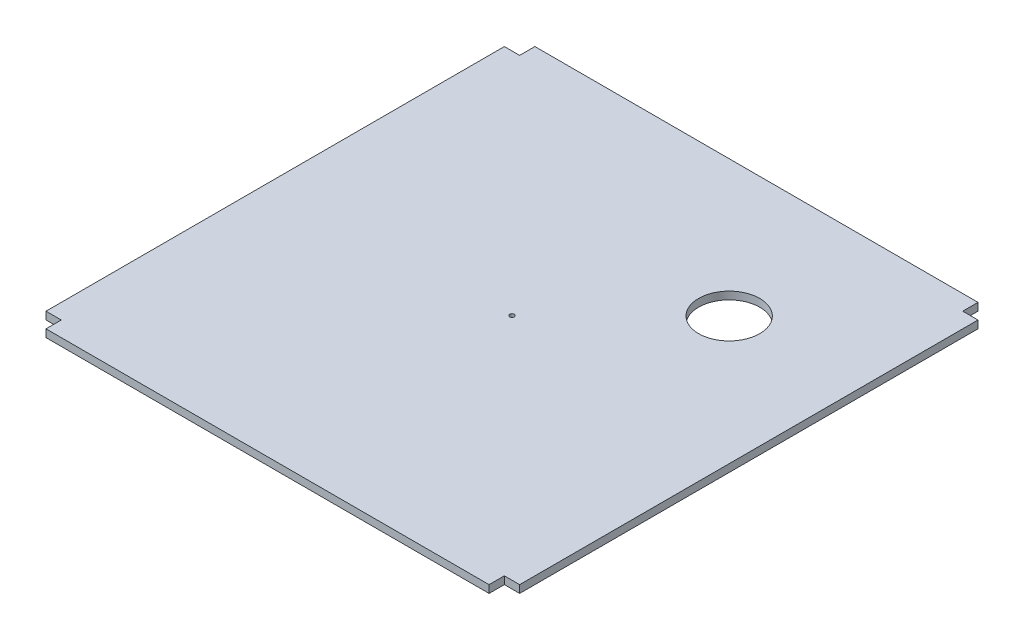
ISO-10303-21;
HEADER;
FILE_DESCRIPTION(('STEP AP214'),'2;1');
FILE_NAME('part.step','',(''),(''),'','','');
FILE_SCHEMA(('AUTOMOTIVE_DESIGN { 1 0 10303 214 1 1 1 1 }'));
ENDSEC;
DATA;
#1=APPLICATION_CONTEXT('core data for automotive mechanical design processes');
#2=APPLICATION_PROTOCOL_DEFINITION('international standard','automotive_design',2000,#1);
#3=PRODUCT_CONTEXT('',#1,'mechanical');
#4=PRODUCT('Part','Part','',(#3));
#5=PRODUCT_RELATED_PRODUCT_CATEGORY('part','',(#4));
#6=PRODUCT_DEFINITION_FORMATION('','',#4);
#7=PRODUCT_DEFINITION_CONTEXT('part definition',#1,'design');
#8=PRODUCT_DEFINITION('design','',#6,#7);
#9=PRODUCT_DEFINITION_SHAPE('','',#8);
#10=(LENGTH_UNIT() NAMED_UNIT(*) SI_UNIT(.MILLI.,.METRE.));
#11=(NAMED_UNIT(*) PLANE_ANGLE_UNIT() SI_UNIT($,.RADIAN.));
#12=(NAMED_UNIT(*) SI_UNIT($,.STERADIAN.) SOLID_ANGLE_UNIT());
#13=UNCERTAINTY_MEASURE_WITH_UNIT(LENGTH_MEASURE(1.E-05),#10,'distance_accuracy_value','');
#14=(GEOMETRIC_REPRESENTATION_CONTEXT(3) GLOBAL_UNCERTAINTY_ASSIGNED_CONTEXT((#13)) GLOBAL_UNIT_ASSIGNED_CONTEXT((#10,
#11,#12)) REPRESENTATION_CONTEXT('',''));
#15=CARTESIAN_POINT('',(0.,0.,0.));
#16=DIRECTION('',(0.,0.,1.));
#17=DIRECTION('',(1.,0.,0.));
#18=AXIS2_PLACEMENT_3D('',#15,#16,#17);
#19=CARTESIAN_POINT('',(155.,5.,160.));
#20=DIRECTION('',(-1.,0.,0.));
#21=DIRECTION('',(0.,0.,1.));
#22=AXIS2_PLACEMENT_3D('',#19,#20,#21);
#23=PLANE('',#22);
#24=DIRECTION('',(0.,1.,0.));
#25=VECTOR('',#24,1.);
#26=CARTESIAN_POINT('',(155.,0.,150.));
#27=LINE('',#26,#25);
#28=CARTESIAN_POINT('',(155.,0.,150.));
#29=VERTEX_POINT('',#28);
#30=CARTESIAN_POINT('',(155.,5.,150.));
#31=VERTEX_POINT('',#30);
#32=EDGE_CURVE('E228',#29,#31,#27,.T.);
#33=ORIENTED_EDGE('',*,*,#32,.F.);
#34=DIRECTION('',(0.,0.,-1.));
#35=VECTOR('',#34,1.);
#36=CARTESIAN_POINT('',(155.,0.,160.));
#37=LINE('',#36,#35);
#38=CARTESIAN_POINT('',(155.,0.,-150.));
#39=VERTEX_POINT('',#38);
#40=EDGE_CURVE('E167',#29,#39,#37,.T.);
#41=ORIENTED_EDGE('',*,*,#40,.T.);
#42=DIRECTION('',(0.,1.,0.));
#43=VECTOR('',#42,1.);
#44=CARTESIAN_POINT('',(155.,0.,-150.));
#45=LINE('',#44,#43);
#46=CARTESIAN_POINT('',(155.,5.,-150.));
#47=VERTEX_POINT('',#46);
#48=EDGE_CURVE('E204',#39,#47,#45,.T.);
#49=ORIENTED_EDGE('',*,*,#48,.T.);
#50=DIRECTION('',(0.,0.,-1.));
#51=VECTOR('',#50,1.);
#52=CARTESIAN_POINT('',(155.,5.,160.));
#53=LINE('',#52,#51);
#54=EDGE_CURVE('E165',#31,#47,#53,.T.);
#55=ORIENTED_EDGE('',*,*,#54,.F.);
#56=EDGE_LOOP('',(#33,#41,#49,#55));
#57=FACE_BOUND('',#56,.T.);
#58=ADVANCED_FACE('F44',(#57),#23,.F.);
#59=CARTESIAN_POINT('',(-155.,5.,-160.));
#60=DIRECTION('',(0.,0.,1.));
#61=DIRECTION('',(1.,0.,0.));
#62=AXIS2_PLACEMENT_3D('',#59,#60,#61);
#63=PLANE('',#62);
#64=DIRECTION('',(0.,1.,0.));
#65=VECTOR('',#64,1.);
#66=CARTESIAN_POINT('',(145.,0.,-160.));
#67=LINE('',#66,#65);
#68=CARTESIAN_POINT('',(145.,0.,-160.));
#69=VERTEX_POINT('',#68);
#70=CARTESIAN_POINT('',(145.,5.,-160.));
#71=VERTEX_POINT('',#70);
#72=EDGE_CURVE('E215',#69,#71,#67,.T.);
#73=ORIENTED_EDGE('',*,*,#72,.F.);
#74=DIRECTION('',(-1.,0.,0.));
#75=VECTOR('',#74,1.);
#76=CARTESIAN_POINT('',(-155.,0.,-160.));
#77=LINE('',#76,#75);
#78=CARTESIAN_POINT('',(-145.,0.,-160.));
#79=VERTEX_POINT('',#78);
#80=EDGE_CURVE('E166',#69,#79,#77,.T.);
#81=ORIENTED_EDGE('',*,*,#80,.T.);
#82=DIRECTION('',(0.,1.,0.));
#83=VECTOR('',#82,1.);
#84=CARTESIAN_POINT('',(-145.,0.,-160.));
#85=LINE('',#84,#83);
#86=CARTESIAN_POINT('',(-145.,5.,-160.));
#87=VERTEX_POINT('',#86);
#88=EDGE_CURVE('E168',#79,#87,#85,.T.);
#89=ORIENTED_EDGE('',*,*,#88,.T.);
#90=DIRECTION('',(-1.,0.,0.));
#91=VECTOR('',#90,1.);
#92=CARTESIAN_POINT('',(-155.,5.,-160.));
#93=LINE('',#92,#91);
#94=EDGE_CURVE('E157',#71,#87,#93,.T.);
#95=ORIENTED_EDGE('',*,*,#94,.F.);
#96=EDGE_LOOP('',(#73,#81,#89,#95));
#97=FACE_BOUND('',#96,.T.);
#98=ADVANCED_FACE('F266',(#97),#63,.F.);
#99=CARTESIAN_POINT('',(-155.,5.,-160.));
#100=DIRECTION('',(1.,0.,0.));
#101=DIRECTION('',(0.,0.,-1.));
#102=AXIS2_PLACEMENT_3D('',#99,#100,#101);
#103=PLANE('',#102);
#104=DIRECTION('',(0.,0.,1.));
#105=VECTOR('',#104,1.);
#106=CARTESIAN_POINT('',(-155.,0.,-160.));
#107=LINE('',#106,#105);
#108=CARTESIAN_POINT('',(-155.,0.,-150.));
#109=VERTEX_POINT('',#108);
#110=CARTESIAN_POINT('',(-155.,0.,150.));
#111=VERTEX_POINT('',#110);
#112=EDGE_CURVE('E151',#109,#111,#107,.T.);
#113=ORIENTED_EDGE('',*,*,#112,.T.);
#114=DIRECTION('',(0.,1.,0.));
#115=VECTOR('',#114,1.);
#116=CARTESIAN_POINT('',(-155.,0.,150.));
#117=LINE('',#116,#115);
#118=CARTESIAN_POINT('',(-155.,5.,150.));
#119=VERTEX_POINT('',#118);
#120=EDGE_CURVE('E138',#111,#119,#117,.T.);
#121=ORIENTED_EDGE('',*,*,#120,.T.);
#122=DIRECTION('',(0.,0.,1.));
#123=VECTOR('',#122,1.);
#124=CARTESIAN_POINT('',(-155.,5.,-160.));
#125=LINE('',#124,#123);
#126=CARTESIAN_POINT('',(-155.,5.,-150.));
#127=VERTEX_POINT('',#126);
#128=EDGE_CURVE('E52',#127,#119,#125,.T.);
#129=ORIENTED_EDGE('',*,*,#128,.F.);
#130=DIRECTION('',(0.,1.,0.));
#131=VECTOR('',#130,1.);
#132=CARTESIAN_POINT('',(-155.,0.,-150.));
#133=LINE('',#132,#131);
#134=EDGE_CURVE('E185',#109,#127,#133,.T.);
#135=ORIENTED_EDGE('',*,*,#134,.F.);
#136=EDGE_LOOP('',(#113,#121,#129,#135));
#137=FACE_BOUND('',#136,.T.);
#138=ADVANCED_FACE('F146',(#137),#103,.F.);
#139=CARTESIAN_POINT('',(-155.,5.,160.));
#140=DIRECTION('',(0.,0.,-1.));
#141=DIRECTION('',(-1.,0.,0.));
#142=AXIS2_PLACEMENT_3D('',#139,#140,#141);
#143=PLANE('',#142);
#144=DIRECTION('',(0.,1.,0.));
#145=VECTOR('',#144,1.);
#146=CARTESIAN_POINT('',(-145.,0.,160.));
#147=LINE('',#146,#145);
#148=CARTESIAN_POINT('',(-145.,0.,160.));
#149=VERTEX_POINT('',#148);
#150=CARTESIAN_POINT('',(-145.,5.,160.));
#151=VERTEX_POINT('',#150);
#152=EDGE_CURVE('E239',#149,#151,#147,.T.);
#153=ORIENTED_EDGE('',*,*,#152,.F.);
#154=DIRECTION('',(1.,0.,0.));
#155=VECTOR('',#154,1.);
#156=CARTESIAN_POINT('',(-155.,0.,160.));
#157=LINE('',#156,#155);
#158=CARTESIAN_POINT('',(145.,0.,160.));
#159=VERTEX_POINT('',#158);
#160=EDGE_CURVE('E48',#149,#159,#157,.T.);
#161=ORIENTED_EDGE('',*,*,#160,.T.);
#162=DIRECTION('',(0.,1.,0.));
#163=VECTOR('',#162,1.);
#164=CARTESIAN_POINT('',(145.,0.,160.));
#165=LINE('',#164,#163);
#166=CARTESIAN_POINT('',(145.,5.,160.));
#167=VERTEX_POINT('',#166);
#168=EDGE_CURVE('E216',#159,#167,#165,.T.);
#169=ORIENTED_EDGE('',*,*,#168,.T.);
#170=DIRECTION('',(1.,0.,0.));
#171=VECTOR('',#170,1.);
#172=CARTESIAN_POINT('',(-155.,5.,160.));
#173=LINE('',#172,#171);
#174=EDGE_CURVE('E11',#151,#167,#173,.T.);
#175=ORIENTED_EDGE('',*,*,#174,.F.);
#176=EDGE_LOOP('',(#153,#161,#169,#175));
#177=FACE_BOUND('',#176,.T.);
#178=ADVANCED_FACE('F251',(#177),#143,.F.);
#179=CARTESIAN_POINT('',(0.,5.,0.));
#180=DIRECTION('',(0.,-1.,0.));
#181=DIRECTION('',(0.,0.,-1.));
#182=AXIS2_PLACEMENT_3D('',#179,#180,#181);
#183=PLANE('',#182);
#184=CARTESIAN_POINT('',(0.,5.,0.));
#185=DIRECTION('',(0.,1.,0.));
#186=DIRECTION('',(0.,0.,1.));
#187=AXIS2_PLACEMENT_3D('',#184,#185,#186);
#188=CIRCLE('',#187,1.5);
#189=CARTESIAN_POINT('',(0.,5.,1.5));
#190=VERTEX_POINT('',#189);
#191=EDGE_CURVE('E199',#190,#190,#188,.T.);
#192=ORIENTED_EDGE('',*,*,#191,.F.);
#193=EDGE_LOOP('',(#192));
#194=FACE_BOUND('',#193,.T.);
#195=CARTESIAN_POINT('',(71.3155891649549,5.,-70.8266158009688));
#196=DIRECTION('',(0.,1.,0.));
#197=DIRECTION('',(0.,0.,1.));
#198=AXIS2_PLACEMENT_3D('',#195,#196,#197);
#199=CIRCLE('',#198,20.);
#200=CARTESIAN_POINT('',(71.3155891649549,5.,-50.8266158009688));
#201=VERTEX_POINT('',#200);
#202=EDGE_CURVE('E203',#201,#201,#199,.T.);
#203=ORIENTED_EDGE('',*,*,#202,.F.);
#204=EDGE_LOOP('',(#203));
#205=FACE_BOUND('',#204,.T.);
#206=DIRECTION('',(0.,0.,-1.));
#207=VECTOR('',#206,1.);
#208=CARTESIAN_POINT('',(-145.,5.,160.));
#209=LINE('',#208,#207);
#210=CARTESIAN_POINT('',(-145.,5.,150.));
#211=VERTEX_POINT('',#210);
#212=EDGE_CURVE('E142',#151,#211,#209,.T.);
#213=ORIENTED_EDGE('',*,*,#212,.F.);
#214=ORIENTED_EDGE('',*,*,#174,.T.);
#215=DIRECTION('',(0.,0.,1.));
#216=VECTOR('',#215,1.);
#217=CARTESIAN_POINT('',(145.,5.,160.));
#218=LINE('',#217,#216);
#219=CARTESIAN_POINT('',(145.,5.,150.));
#220=VERTEX_POINT('',#219);
#221=EDGE_CURVE('E227',#220,#167,#218,.T.);
#222=ORIENTED_EDGE('',*,*,#221,.F.);
#223=DIRECTION('',(-1.,0.,0.));
#224=VECTOR('',#223,1.);
#225=CARTESIAN_POINT('',(155.,5.,150.));
#226=LINE('',#225,#224);
#227=EDGE_CURVE('E155',#31,#220,#226,.T.);
#228=ORIENTED_EDGE('',*,*,#227,.F.);
#229=ORIENTED_EDGE('',*,*,#54,.T.);
#230=DIRECTION('',(1.,0.,0.));
#231=VECTOR('',#230,1.);
#232=CARTESIAN_POINT('',(155.,5.,-150.));
#233=LINE('',#232,#231);
#234=CARTESIAN_POINT('',(145.,5.,-150.));
#235=VERTEX_POINT('',#234);
#236=EDGE_CURVE('E208',#235,#47,#233,.T.);
#237=ORIENTED_EDGE('',*,*,#236,.F.);
#238=DIRECTION('',(0.,0.,1.));
#239=VECTOR('',#238,1.);
#240=CARTESIAN_POINT('',(145.,5.,-160.));
#241=LINE('',#240,#239);
#242=EDGE_CURVE('E213',#71,#235,#241,.T.);
#243=ORIENTED_EDGE('',*,*,#242,.F.);
#244=ORIENTED_EDGE('',*,*,#94,.T.);
#245=DIRECTION('',(0.,0.,-1.));
#246=VECTOR('',#245,1.);
#247=CARTESIAN_POINT('',(-145.,5.,-160.));
#248=LINE('',#247,#246);
#249=CARTESIAN_POINT('',(-145.,5.,-150.));
#250=VERTEX_POINT('',#249);
#251=EDGE_CURVE('E189',#250,#87,#248,.T.);
#252=ORIENTED_EDGE('',*,*,#251,.F.);
#253=DIRECTION('',(1.,0.,0.));
#254=VECTOR('',#253,1.);
#255=CARTESIAN_POINT('',(-155.,5.,-150.));
#256=LINE('',#255,#254);
#257=EDGE_CURVE('E158',#127,#250,#256,.T.);
#258=ORIENTED_EDGE('',*,*,#257,.F.);
#259=ORIENTED_EDGE('',*,*,#128,.T.);
#260=DIRECTION('',(-1.,0.,0.));
#261=VECTOR('',#260,1.);
#262=CARTESIAN_POINT('',(-155.,5.,150.));
#263=LINE('',#262,#261);
#264=EDGE_CURVE('E133',#211,#119,#263,.T.);
#265=ORIENTED_EDGE('',*,*,#264,.F.);
#266=EDGE_LOOP('',(#213,#214,#222,#228,#229,#237,#243,#244,#252,#258,#259,#265));
#267=FACE_BOUND('',#266,.T.);
#268=ADVANCED_FACE('F154',(#194,#205,#267),#183,.F.);
#269=CARTESIAN_POINT('',(0.,0.,0.));
#270=DIRECTION('',(0.,-1.,0.));
#271=DIRECTION('',(0.,0.,-1.));
#272=AXIS2_PLACEMENT_3D('',#269,#270,#271);
#273=PLANE('',#272);
#274=CARTESIAN_POINT('',(0.,0.,0.));
#275=DIRECTION('',(0.,1.,0.));
#276=DIRECTION('',(0.,0.,1.));
#277=AXIS2_PLACEMENT_3D('',#274,#275,#276);
#278=CIRCLE('',#277,1.5);
#279=CARTESIAN_POINT('',(0.,0.,1.5));
#280=VERTEX_POINT('',#279);
#281=EDGE_CURVE('E197',#280,#280,#278,.T.);
#282=ORIENTED_EDGE('',*,*,#281,.T.);
#283=EDGE_LOOP('',(#282));
#284=FACE_BOUND('',#283,.T.);
#285=CARTESIAN_POINT('',(71.3155891649549,0.,-70.8266158009688));
#286=DIRECTION('',(0.,1.,0.));
#287=DIRECTION('',(0.,0.,1.));
#288=AXIS2_PLACEMENT_3D('',#285,#286,#287);
#289=CIRCLE('',#288,20.);
#290=CARTESIAN_POINT('',(71.3155891649549,0.,-50.8266158009688));
#291=VERTEX_POINT('',#290);
#292=EDGE_CURVE('E243',#291,#291,#289,.T.);
#293=ORIENTED_EDGE('',*,*,#292,.T.);
#294=EDGE_LOOP('',(#293));
#295=FACE_BOUND('',#294,.T.);
#296=DIRECTION('',(0.,0.,-1.));
#297=VECTOR('',#296,1.);
#298=CARTESIAN_POINT('',(-145.,0.,160.));
#299=LINE('',#298,#297);
#300=CARTESIAN_POINT('',(-145.,0.,150.));
#301=VERTEX_POINT('',#300);
#302=EDGE_CURVE('E141',#149,#301,#299,.T.);
#303=ORIENTED_EDGE('',*,*,#302,.T.);
#304=DIRECTION('',(-1.,0.,0.));
#305=VECTOR('',#304,1.);
#306=CARTESIAN_POINT('',(-155.,0.,150.));
#307=LINE('',#306,#305);
#308=EDGE_CURVE('E62',#301,#111,#307,.T.);
#309=ORIENTED_EDGE('',*,*,#308,.T.);
#310=ORIENTED_EDGE('',*,*,#112,.F.);
#311=DIRECTION('',(1.,0.,0.));
#312=VECTOR('',#311,1.);
#313=CARTESIAN_POINT('',(-155.,0.,-150.));
#314=LINE('',#313,#312);
#315=CARTESIAN_POINT('',(-145.,0.,-150.));
#316=VERTEX_POINT('',#315);
#317=EDGE_CURVE('E193',#109,#316,#314,.T.);
#318=ORIENTED_EDGE('',*,*,#317,.T.);
#319=DIRECTION('',(0.,0.,-1.));
#320=VECTOR('',#319,1.);
#321=CARTESIAN_POINT('',(-145.,0.,-160.));
#322=LINE('',#321,#320);
#323=EDGE_CURVE('E183',#316,#79,#322,.T.);
#324=ORIENTED_EDGE('',*,*,#323,.T.);
#325=ORIENTED_EDGE('',*,*,#80,.F.);
#326=DIRECTION('',(0.,0.,1.));
#327=VECTOR('',#326,1.);
#328=CARTESIAN_POINT('',(145.,0.,-160.));
#329=LINE('',#328,#327);
#330=CARTESIAN_POINT('',(145.,0.,-150.));
#331=VERTEX_POINT('',#330);
#332=EDGE_CURVE('E202',#69,#331,#329,.T.);
#333=ORIENTED_EDGE('',*,*,#332,.T.);
#334=DIRECTION('',(1.,0.,0.));
#335=VECTOR('',#334,1.);
#336=CARTESIAN_POINT('',(155.,0.,-150.));
#337=LINE('',#336,#335);
#338=EDGE_CURVE('E207',#331,#39,#337,.T.);
#339=ORIENTED_EDGE('',*,*,#338,.T.);
#340=ORIENTED_EDGE('',*,*,#40,.F.);
#341=DIRECTION('',(-1.,0.,0.));
#342=VECTOR('',#341,1.);
#343=CARTESIAN_POINT('',(155.,0.,150.));
#344=LINE('',#343,#342);
#345=CARTESIAN_POINT('',(145.,0.,150.));
#346=VERTEX_POINT('',#345);
#347=EDGE_CURVE('E224',#29,#346,#344,.T.);
#348=ORIENTED_EDGE('',*,*,#347,.T.);
#349=DIRECTION('',(0.,0.,1.));
#350=VECTOR('',#349,1.);
#351=CARTESIAN_POINT('',(145.,0.,160.));
#352=LINE('',#351,#350);
#353=EDGE_CURVE('E69',#346,#159,#352,.T.);
#354=ORIENTED_EDGE('',*,*,#353,.T.);
#355=ORIENTED_EDGE('',*,*,#160,.F.);
#356=EDGE_LOOP('',(#303,#309,#310,#318,#324,#325,#333,#339,#340,#348,#354,#355));
#357=FACE_BOUND('',#356,.T.);
#358=ADVANCED_FACE('F252',(#284,#295,#357),#273,.T.);
#359=CARTESIAN_POINT('',(71.3155891649549,0.,-70.8266158009688));
#360=DIRECTION('',(0.,1.,0.));
#361=DIRECTION('',(0.,0.,1.));
#362=AXIS2_PLACEMENT_3D('',#359,#360,#361);
#363=CYLINDRICAL_SURFACE('',#362,20.);
#364=ORIENTED_EDGE('',*,*,#292,.F.);
#365=EDGE_LOOP('',(#364));
#366=FACE_BOUND('',#365,.T.);
#367=ORIENTED_EDGE('',*,*,#202,.T.);
#368=EDGE_LOOP('',(#367));
#369=FACE_BOUND('',#368,.T.);
#370=ADVANCED_FACE('F249',(#366,#369),#363,.F.);
#371=CARTESIAN_POINT('',(0.,0.,0.));
#372=DIRECTION('',(0.,1.,0.));
#373=DIRECTION('',(0.,0.,1.));
#374=AXIS2_PLACEMENT_3D('',#371,#372,#373);
#375=CYLINDRICAL_SURFACE('',#374,1.5);
#376=ORIENTED_EDGE('',*,*,#281,.F.);
#377=EDGE_LOOP('',(#376));
#378=FACE_BOUND('',#377,.T.);
#379=ORIENTED_EDGE('',*,*,#191,.T.);
#380=EDGE_LOOP('',(#379));
#381=FACE_BOUND('',#380,.T.);
#382=ADVANCED_FACE('F297',(#378,#381),#375,.F.);
#383=CARTESIAN_POINT('',(-145.,0.,-160.));
#384=DIRECTION('',(1.,0.,0.));
#385=DIRECTION('',(0.,0.,-1.));
#386=AXIS2_PLACEMENT_3D('',#383,#384,#385);
#387=PLANE('',#386);
#388=ORIENTED_EDGE('',*,*,#251,.T.);
#389=ORIENTED_EDGE('',*,*,#88,.F.);
#390=ORIENTED_EDGE('',*,*,#323,.F.);
#391=DIRECTION('',(0.,1.,0.));
#392=VECTOR('',#391,1.);
#393=CARTESIAN_POINT('',(-145.,0.,-150.));
#394=LINE('',#393,#392);
#395=EDGE_CURVE('E184',#316,#250,#394,.T.);
#396=ORIENTED_EDGE('',*,*,#395,.T.);
#397=EDGE_LOOP('',(#388,#389,#390,#396));
#398=FACE_BOUND('',#397,.T.);
#399=ADVANCED_FACE('F288',(#398),#387,.F.);
#400=CARTESIAN_POINT('',(-155.,0.,-150.));
#401=DIRECTION('',(0.,0.,1.));
#402=DIRECTION('',(1.,0.,0.));
#403=AXIS2_PLACEMENT_3D('',#400,#401,#402);
#404=PLANE('',#403);
#405=ORIENTED_EDGE('',*,*,#257,.T.);
#406=ORIENTED_EDGE('',*,*,#395,.F.);
#407=ORIENTED_EDGE('',*,*,#317,.F.);
#408=ORIENTED_EDGE('',*,*,#134,.T.);
#409=EDGE_LOOP('',(#405,#406,#407,#408));
#410=FACE_BOUND('',#409,.T.);
#411=ADVANCED_FACE('F289',(#410),#404,.F.);
#412=CARTESIAN_POINT('',(155.,0.,-150.));
#413=DIRECTION('',(0.,0.,1.));
#414=DIRECTION('',(1.,0.,0.));
#415=AXIS2_PLACEMENT_3D('',#412,#413,#414);
#416=PLANE('',#415);
#417=ORIENTED_EDGE('',*,*,#236,.T.);
#418=ORIENTED_EDGE('',*,*,#48,.F.);
#419=ORIENTED_EDGE('',*,*,#338,.F.);
#420=DIRECTION('',(0.,1.,0.));
#421=VECTOR('',#420,1.);
#422=CARTESIAN_POINT('',(145.,0.,-150.));
#423=LINE('',#422,#421);
#424=EDGE_CURVE('E219',#331,#235,#423,.T.);
#425=ORIENTED_EDGE('',*,*,#424,.T.);
#426=EDGE_LOOP('',(#417,#418,#419,#425));
#427=FACE_BOUND('',#426,.T.);
#428=ADVANCED_FACE('F276',(#427),#416,.F.);
#429=CARTESIAN_POINT('',(145.,0.,-160.));
#430=DIRECTION('',(-1.,0.,0.));
#431=DIRECTION('',(0.,0.,1.));
#432=AXIS2_PLACEMENT_3D('',#429,#430,#431);
#433=PLANE('',#432);
#434=ORIENTED_EDGE('',*,*,#242,.T.);
#435=ORIENTED_EDGE('',*,*,#424,.F.);
#436=ORIENTED_EDGE('',*,*,#332,.F.);
#437=ORIENTED_EDGE('',*,*,#72,.T.);
#438=EDGE_LOOP('',(#434,#435,#436,#437));
#439=FACE_BOUND('',#438,.T.);
#440=ADVANCED_FACE('F282',(#439),#433,.F.);
#441=CARTESIAN_POINT('',(145.,0.,160.));
#442=DIRECTION('',(-1.,0.,0.));
#443=DIRECTION('',(0.,0.,1.));
#444=AXIS2_PLACEMENT_3D('',#441,#442,#443);
#445=PLANE('',#444);
#446=ORIENTED_EDGE('',*,*,#221,.T.);
#447=ORIENTED_EDGE('',*,*,#168,.F.);
#448=ORIENTED_EDGE('',*,*,#353,.F.);
#449=DIRECTION('',(0.,1.,0.));
#450=VECTOR('',#449,1.);
#451=CARTESIAN_POINT('',(145.,0.,150.));
#452=LINE('',#451,#450);
#453=EDGE_CURVE('E231',#346,#220,#452,.T.);
#454=ORIENTED_EDGE('',*,*,#453,.T.);
#455=EDGE_LOOP('',(#446,#447,#448,#454));
#456=FACE_BOUND('',#455,.T.);
#457=ADVANCED_FACE('F304',(#456),#445,.F.);
#458=CARTESIAN_POINT('',(155.,0.,150.));
#459=DIRECTION('',(0.,0.,-1.));
#460=DIRECTION('',(-1.,0.,0.));
#461=AXIS2_PLACEMENT_3D('',#458,#459,#460);
#462=PLANE('',#461);
#463=ORIENTED_EDGE('',*,*,#227,.T.);
#464=ORIENTED_EDGE('',*,*,#453,.F.);
#465=ORIENTED_EDGE('',*,*,#347,.F.);
#466=ORIENTED_EDGE('',*,*,#32,.T.);
#467=EDGE_LOOP('',(#463,#464,#465,#466));
#468=FACE_BOUND('',#467,.T.);
#469=ADVANCED_FACE('F307',(#468),#462,.F.);
#470=CARTESIAN_POINT('',(-155.,0.,150.));
#471=DIRECTION('',(0.,0.,-1.));
#472=DIRECTION('',(-1.,0.,0.));
#473=AXIS2_PLACEMENT_3D('',#470,#471,#472);
#474=PLANE('',#473);
#475=ORIENTED_EDGE('',*,*,#264,.T.);
#476=ORIENTED_EDGE('',*,*,#120,.F.);
#477=ORIENTED_EDGE('',*,*,#308,.F.);
#478=DIRECTION('',(0.,1.,0.));
#479=VECTOR('',#478,1.);
#480=CARTESIAN_POINT('',(-145.,0.,150.));
#481=LINE('',#480,#479);
#482=EDGE_CURVE('E140',#301,#211,#481,.T.);
#483=ORIENTED_EDGE('',*,*,#482,.T.);
#484=EDGE_LOOP('',(#475,#476,#477,#483));
#485=FACE_BOUND('',#484,.T.);
#486=ADVANCED_FACE('F131',(#485),#474,.F.);
#487=CARTESIAN_POINT('',(-145.,0.,160.));
#488=DIRECTION('',(1.,0.,0.));
#489=DIRECTION('',(0.,0.,-1.));
#490=AXIS2_PLACEMENT_3D('',#487,#488,#489);
#491=PLANE('',#490);
#492=ORIENTED_EDGE('',*,*,#212,.T.);
#493=ORIENTED_EDGE('',*,*,#482,.F.);
#494=ORIENTED_EDGE('',*,*,#302,.F.);
#495=ORIENTED_EDGE('',*,*,#152,.T.);
#496=EDGE_LOOP('',(#492,#493,#494,#495));
#497=FACE_BOUND('',#496,.T.);
#498=ADVANCED_FACE('F315',(#497),#491,.F.);
#499=CLOSED_SHELL('',(#58,#98,#138,#178,#268,#358,#370,#382,#399,#411,#428,#440,#457,#469,#486,#498));
#500=MANIFOLD_SOLID_BREP('B2',#499);
#501=ADVANCED_BREP_SHAPE_REPRESENTATION('',(#18,#500),#14);
#502=SHAPE_DEFINITION_REPRESENTATION(#9,#501);
ENDSEC;
END-ISO-10303-21;
